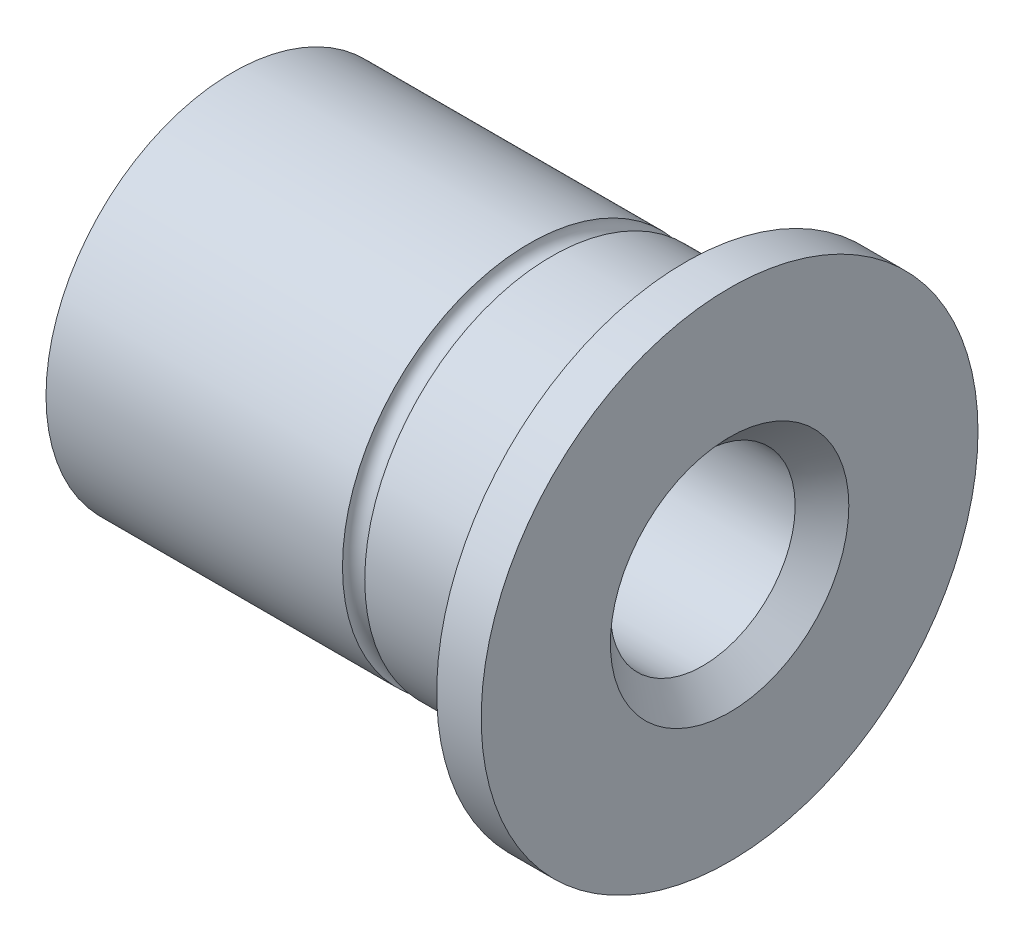
ISO-10303-21;
HEADER;
FILE_DESCRIPTION(('STEP AP214'),'2;1');
FILE_NAME('part.step','',(''),(''),'','','');
FILE_SCHEMA(('AUTOMOTIVE_DESIGN { 1 0 10303 214 1 1 1 1 }'));
ENDSEC;
DATA;
#1=APPLICATION_CONTEXT('core data for automotive mechanical design processes');
#2=APPLICATION_PROTOCOL_DEFINITION('international standard','automotive_design',2000,#1);
#3=PRODUCT_CONTEXT('',#1,'mechanical');
#4=PRODUCT('Part','Part','',(#3));
#5=PRODUCT_RELATED_PRODUCT_CATEGORY('part','',(#4));
#6=PRODUCT_DEFINITION_FORMATION('','',#4);
#7=PRODUCT_DEFINITION_CONTEXT('part definition',#1,'design');
#8=PRODUCT_DEFINITION('design','',#6,#7);
#9=PRODUCT_DEFINITION_SHAPE('','',#8);
#10=(LENGTH_UNIT() NAMED_UNIT(*) SI_UNIT(.MILLI.,.METRE.));
#11=(NAMED_UNIT(*) PLANE_ANGLE_UNIT() SI_UNIT($,.RADIAN.));
#12=(NAMED_UNIT(*) SI_UNIT($,.STERADIAN.) SOLID_ANGLE_UNIT());
#13=UNCERTAINTY_MEASURE_WITH_UNIT(LENGTH_MEASURE(1.E-05),#10,'distance_accuracy_value','');
#14=(GEOMETRIC_REPRESENTATION_CONTEXT(3) GLOBAL_UNCERTAINTY_ASSIGNED_CONTEXT((#13)) GLOBAL_UNIT_ASSIGNED_CONTEXT((#10,
#11,#12)) REPRESENTATION_CONTEXT('',''));
#15=CARTESIAN_POINT('',(0.,0.,0.));
#16=DIRECTION('',(0.,0.,1.));
#17=DIRECTION('',(1.,0.,0.));
#18=AXIS2_PLACEMENT_3D('',#15,#16,#17);
#19=CARTESIAN_POINT('',(-0.28448,0.,1.13411));
#20=DIRECTION('',(-1.,0.,0.));
#21=DIRECTION('',(0.,0.,1.));
#22=AXIS2_PLACEMENT_3D('',#19,#20,#21);
#23=PLANE('',#22);
#24=CARTESIAN_POINT('',(-0.28448,0.,0.));
#25=DIRECTION('',(1.,0.,0.));
#26=DIRECTION('',(0.,0.,-1.));
#27=AXIS2_PLACEMENT_3D('',#24,#25,#26);
#28=CIRCLE('',#27,1.5875);
#29=CARTESIAN_POINT('',(-0.28448,0.,-1.5875));
#30=VERTEX_POINT('',#29);
#31=EDGE_CURVE('E19',#30,#30,#28,.T.);
#32=ORIENTED_EDGE('',*,*,#31,.F.);
#33=EDGE_LOOP('',(#32));
#34=FACE_BOUND('',#33,.T.);
#35=CARTESIAN_POINT('',(-0.28448,0.,0.));
#36=DIRECTION('',(1.,0.,0.));
#37=DIRECTION('',(0.,0.,-1.));
#38=AXIS2_PLACEMENT_3D('',#35,#36,#37);
#39=CIRCLE('',#38,1.07442);
#40=CARTESIAN_POINT('',(-0.28448,0.,-1.07442));
#41=VERTEX_POINT('',#40);
#42=EDGE_CURVE('E48',#41,#41,#39,.F.);
#43=ORIENTED_EDGE('',*,*,#42,.F.);
#44=EDGE_LOOP('',(#43));
#45=FACE_BOUND('',#44,.T.);
#46=ADVANCED_FACE('F16',(#34,#45),#23,.T.);
#47=CARTESIAN_POINT('',(-0.14224,0.,0.));
#48=DIRECTION('',(1.,0.,0.));
#49=DIRECTION('',(0.,0.,-1.));
#50=AXIS2_PLACEMENT_3D('',#47,#48,#49);
#51=CYLINDRICAL_SURFACE('',#50,1.5875);
#52=CARTESIAN_POINT('',(0.,0.,0.));
#53=DIRECTION('',(1.,0.,0.));
#54=DIRECTION('',(0.,0.,-1.));
#55=AXIS2_PLACEMENT_3D('',#52,#53,#54);
#56=CIRCLE('',#55,1.5875);
#57=CARTESIAN_POINT('',(0.,0.,-1.5875));
#58=VERTEX_POINT('',#57);
#59=EDGE_CURVE('E46',#58,#58,#56,.T.);
#60=ORIENTED_EDGE('',*,*,#59,.F.);
#61=EDGE_LOOP('',(#60));
#62=FACE_BOUND('',#61,.T.);
#63=ORIENTED_EDGE('',*,*,#31,.T.);
#64=EDGE_LOOP('',(#63));
#65=FACE_BOUND('',#64,.T.);
#66=ADVANCED_FACE('F55',(#62,#65),#51,.T.);
#67=CARTESIAN_POINT('',(-0.3556,0.,0.));
#68=DIRECTION('',(1.,0.,0.));
#69=DIRECTION('',(0.,0.,-1.));
#70=AXIS2_PLACEMENT_3D('',#67,#68,#69);
#71=CYLINDRICAL_SURFACE('',#70,1.07442);
#72=ORIENTED_EDGE('',*,*,#42,.T.);
#73=EDGE_LOOP('',(#72));
#74=FACE_BOUND('',#73,.T.);
#75=CARTESIAN_POINT('',(-0.42672,0.,0.));
#76=DIRECTION('',(1.,0.,0.));
#77=DIRECTION('',(0.,0.,-1.));
#78=AXIS2_PLACEMENT_3D('',#75,#76,#77);
#79=CIRCLE('',#78,1.07442);
#80=CARTESIAN_POINT('',(-0.42672,0.,-1.07442));
#81=VERTEX_POINT('',#80);
#82=EDGE_CURVE('E43',#81,#81,#79,.F.);
#83=ORIENTED_EDGE('',*,*,#82,.F.);
#84=EDGE_LOOP('',(#83));
#85=FACE_BOUND('',#84,.T.);
#86=ADVANCED_FACE('F63',(#74,#85),#71,.T.);
#87=CARTESIAN_POINT('',(0.,0.,0.5969));
#88=DIRECTION('',(1.,0.,0.));
#89=DIRECTION('',(0.,0.,-1.));
#90=AXIS2_PLACEMENT_3D('',#87,#88,#89);
#91=PLANE('',#90);
#92=ORIENTED_EDGE('',*,*,#59,.T.);
#93=EDGE_LOOP('',(#92));
#94=FACE_BOUND('',#93,.T.);
#95=CARTESIAN_POINT('',(0.,0.,0.));
#96=DIRECTION('',(1.,0.,0.));
#97=DIRECTION('',(0.,0.,-1.));
#98=AXIS2_PLACEMENT_3D('',#95,#96,#97);
#99=CIRCLE('',#98,0.762000000008811);
#100=CARTESIAN_POINT('',(0.,0.,-0.762000000008811));
#101=VERTEX_POINT('',#100);
#102=EDGE_CURVE('E40',#101,#101,#99,.F.);
#103=ORIENTED_EDGE('',*,*,#102,.T.);
#104=EDGE_LOOP('',(#103));
#105=FACE_BOUND('',#104,.T.);
#106=ADVANCED_FACE('F130',(#94,#105),#91,.T.);
#107=CARTESIAN_POINT('',(-0.42672,0.,1.13411));
#108=DIRECTION('',(1.,0.,0.));
#109=DIRECTION('',(0.,0.,-1.));
#110=AXIS2_PLACEMENT_3D('',#107,#108,#109);
#111=PLANE('',#110);
#112=CARTESIAN_POINT('',(-0.42672,0.,0.));
#113=DIRECTION('',(1.,0.,0.));
#114=DIRECTION('',(0.,0.,-1.));
#115=AXIS2_PLACEMENT_3D('',#112,#113,#114);
#116=CIRCLE('',#115,1.1938);
#117=CARTESIAN_POINT('',(-0.42672,0.,-1.1938));
#118=VERTEX_POINT('',#117);
#119=EDGE_CURVE('E37',#118,#118,#116,.F.);
#120=ORIENTED_EDGE('',*,*,#119,.F.);
#121=EDGE_LOOP('',(#120));
#122=FACE_BOUND('',#121,.T.);
#123=ORIENTED_EDGE('',*,*,#82,.T.);
#124=EDGE_LOOP('',(#123));
#125=FACE_BOUND('',#124,.T.);
#126=ADVANCED_FACE('F143',(#122,#125),#111,.T.);
#127=CARTESIAN_POINT('',(0.,0.,0.));
#128=DIRECTION('',(1.,0.,0.));
#129=DIRECTION('',(0.,0.,-1.));
#130=AXIS2_PLACEMENT_3D('',#127,#128,#129);
#131=CONICAL_SURFACE('',#130,0.762000000008811,0.785398163397448);
#132=ORIENTED_EDGE('',*,*,#102,.F.);
#133=EDGE_LOOP('',(#132));
#134=FACE_BOUND('',#133,.T.);
#135=CARTESIAN_POINT('',(-0.17145,0.,0.));
#136=DIRECTION('',(1.,0.,0.));
#137=DIRECTION('',(0.,0.,-1.));
#138=AXIS2_PLACEMENT_3D('',#135,#136,#137);
#139=CIRCLE('',#138,0.59055);
#140=CARTESIAN_POINT('',(-0.17145,0.,-0.59055));
#141=VERTEX_POINT('',#140);
#142=EDGE_CURVE('E32',#141,#141,#139,.F.);
#143=ORIENTED_EDGE('',*,*,#142,.T.);
#144=EDGE_LOOP('',(#143));
#145=FACE_BOUND('',#144,.T.);
#146=ADVANCED_FACE('F93',(#134,#145),#131,.F.);
#147=CARTESIAN_POINT('',(-1.80086,0.,0.));
#148=DIRECTION('',(1.,0.,0.));
#149=DIRECTION('',(0.,0.,-1.));
#150=AXIS2_PLACEMENT_3D('',#147,#148,#149);
#151=CYLINDRICAL_SURFACE('',#150,1.1938);
#152=ORIENTED_EDGE('',*,*,#119,.T.);
#153=EDGE_LOOP('',(#152));
#154=FACE_BOUND('',#153,.T.);
#155=CARTESIAN_POINT('',(-1.13792,0.,0.));
#156=DIRECTION('',(-1.,0.,0.));
#157=DIRECTION('',(0.,0.,1.));
#158=AXIS2_PLACEMENT_3D('',#155,#156,#157);
#159=CIRCLE('',#158,1.1938);
#160=CARTESIAN_POINT('',(-1.13792,0.,1.1938));
#161=VERTEX_POINT('',#160);
#162=EDGE_CURVE('E86',#161,#161,#159,.F.);
#163=ORIENTED_EDGE('',*,*,#162,.T.);
#164=EDGE_LOOP('',(#163));
#165=FACE_BOUND('',#164,.T.);
#166=ADVANCED_FACE('F98',(#154,#165),#151,.T.);
#167=CARTESIAN_POINT('',(-1.5875,0.,0.));
#168=DIRECTION('',(1.,0.,0.));
#169=DIRECTION('',(0.,0.,-1.));
#170=AXIS2_PLACEMENT_3D('',#167,#168,#169);
#171=CYLINDRICAL_SURFACE('',#170,0.59055);
#172=ORIENTED_EDGE('',*,*,#142,.F.);
#173=EDGE_LOOP('',(#172));
#174=FACE_BOUND('',#173,.T.);
#175=CARTESIAN_POINT('',(-3.00355000001673,0.,0.));
#176=DIRECTION('',(-1.,0.,0.));
#177=DIRECTION('',(0.,0.,-1.));
#178=AXIS2_PLACEMENT_3D('',#175,#176,#177);
#179=CIRCLE('',#178,0.59054999996988);
#180=CARTESIAN_POINT('',(-3.00355000001673,0.,-0.59054999996988));
#181=VERTEX_POINT('',#180);
#182=EDGE_CURVE('E36',#181,#181,#179,.T.);
#183=ORIENTED_EDGE('',*,*,#182,.T.);
#184=EDGE_LOOP('',(#183));
#185=FACE_BOUND('',#184,.T.);
#186=ADVANCED_FACE('F95',(#174,#185),#171,.F.);
#187=CARTESIAN_POINT('',(-3.17500000005566,0.,0.));
#188=DIRECTION('',(-1.,0.,0.));
#189=DIRECTION('',(0.,0.,1.));
#190=AXIS2_PLACEMENT_3D('',#187,#188,#189);
#191=CONICAL_SURFACE('',#190,0.762000000008811,0.785398163231675);
#192=ORIENTED_EDGE('',*,*,#182,.F.);
#193=EDGE_LOOP('',(#192));
#194=FACE_BOUND('',#193,.T.);
#195=CARTESIAN_POINT('',(-3.17500000005566,0.,0.));
#196=DIRECTION('',(-1.,0.,0.));
#197=DIRECTION('',(0.,0.,1.));
#198=AXIS2_PLACEMENT_3D('',#195,#196,#197);
#199=CIRCLE('',#198,0.762000000008811);
#200=CARTESIAN_POINT('',(-3.17500000005566,0.,0.76200000000881));
#201=VERTEX_POINT('',#200);
#202=EDGE_CURVE('E28',#201,#201,#199,.F.);
#203=ORIENTED_EDGE('',*,*,#202,.F.);
#204=EDGE_LOOP('',(#203));
#205=FACE_BOUND('',#204,.T.);
#206=ADVANCED_FACE('F80',(#194,#205),#191,.F.);
#207=CARTESIAN_POINT('',(-1.20904,0.,0.));
#208=DIRECTION('',(-1.,0.,0.));
#209=DIRECTION('',(0.,0.,1.));
#210=AXIS2_PLACEMENT_3D('',#207,#208,#209);
#211=TOROIDAL_SURFACE('',#210,1.1938,0.0711199999999999);
#212=ORIENTED_EDGE('',*,*,#162,.F.);
#213=EDGE_LOOP('',(#212));
#214=FACE_BOUND('',#213,.T.);
#215=CARTESIAN_POINT('',(-1.28016,0.,0.));
#216=DIRECTION('',(1.,0.,0.));
#217=DIRECTION('',(0.,0.,-1.));
#218=AXIS2_PLACEMENT_3D('',#215,#216,#217);
#219=CIRCLE('',#218,1.1938);
#220=CARTESIAN_POINT('',(-1.28016,0.,-1.1938));
#221=VERTEX_POINT('',#220);
#222=EDGE_CURVE('E23',#221,#221,#219,.F.);
#223=ORIENTED_EDGE('',*,*,#222,.F.);
#224=EDGE_LOOP('',(#223));
#225=FACE_BOUND('',#224,.T.);
#226=ADVANCED_FACE('F73',(#214,#225),#211,.F.);
#227=CARTESIAN_POINT('',(-3.175,0.,0.5969));
#228=DIRECTION('',(-1.,0.,0.));
#229=DIRECTION('',(0.,0.,1.));
#230=AXIS2_PLACEMENT_3D('',#227,#228,#229);
#231=PLANE('',#230);
#232=CARTESIAN_POINT('',(-3.175,0.,0.));
#233=DIRECTION('',(1.,0.,0.));
#234=DIRECTION('',(0.,0.,-1.));
#235=AXIS2_PLACEMENT_3D('',#232,#233,#234);
#236=CIRCLE('',#235,1.1938);
#237=CARTESIAN_POINT('',(-3.175,0.,-1.1938));
#238=VERTEX_POINT('',#237);
#239=EDGE_CURVE('E10',#238,#238,#236,.T.);
#240=ORIENTED_EDGE('',*,*,#239,.F.);
#241=EDGE_LOOP('',(#240));
#242=FACE_BOUND('',#241,.T.);
#243=ORIENTED_EDGE('',*,*,#202,.T.);
#244=EDGE_LOOP('',(#243));
#245=FACE_BOUND('',#244,.T.);
#246=ADVANCED_FACE('F67',(#242,#245),#231,.T.);
#247=CARTESIAN_POINT('',(-1.80086,0.,0.));
#248=DIRECTION('',(1.,0.,0.));
#249=DIRECTION('',(0.,0.,-1.));
#250=AXIS2_PLACEMENT_3D('',#247,#248,#249);
#251=CYLINDRICAL_SURFACE('',#250,1.1938);
#252=ORIENTED_EDGE('',*,*,#222,.T.);
#253=EDGE_LOOP('',(#252));
#254=FACE_BOUND('',#253,.T.);
#255=ORIENTED_EDGE('',*,*,#239,.T.);
#256=EDGE_LOOP('',(#255));
#257=FACE_BOUND('',#256,.T.);
#258=ADVANCED_FACE('F65',(#254,#257),#251,.T.);
#259=CLOSED_SHELL('',(#46,#66,#86,#106,#126,#146,#166,#186,#206,#226,#246,#258));
#260=MANIFOLD_SOLID_BREP('B1',#259);
#261=ADVANCED_BREP_SHAPE_REPRESENTATION('',(#18,#260),#14);
#262=SHAPE_DEFINITION_REPRESENTATION(#9,#261);
ENDSEC;
END-ISO-10303-21;
